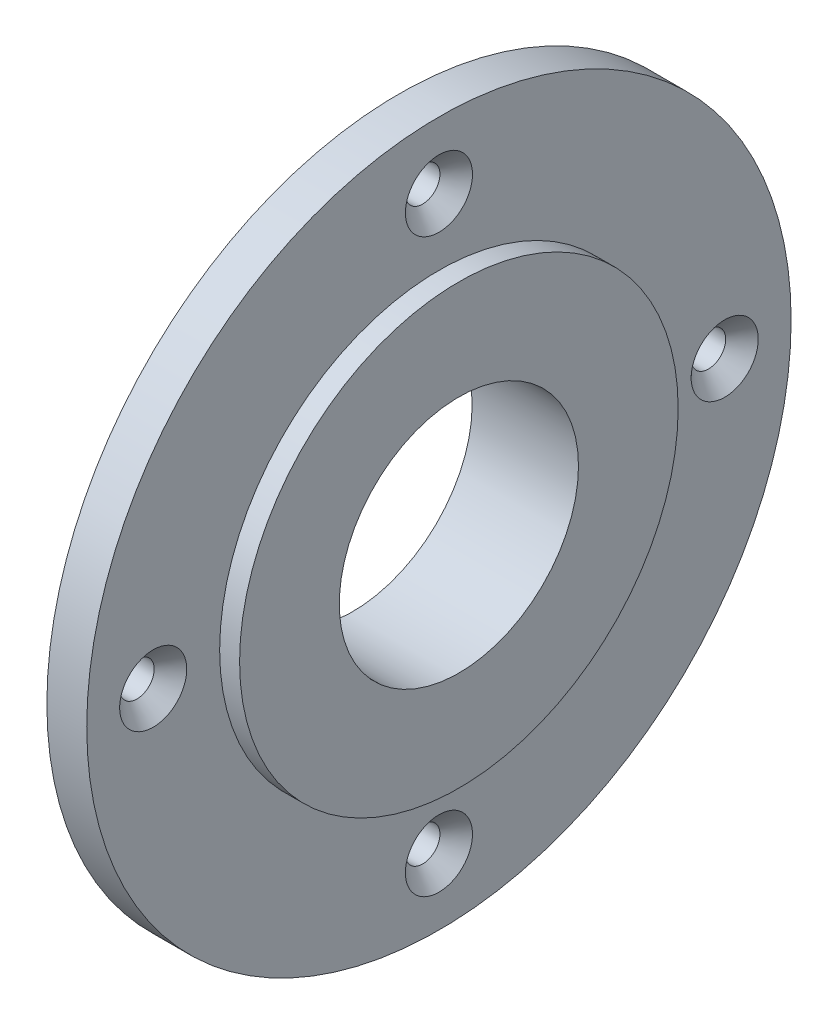
ISO-10303-21;
HEADER;
FILE_DESCRIPTION(('STEP AP214'),'2;1');
FILE_NAME('part.step','',(''),(''),'','','');
FILE_SCHEMA(('AUTOMOTIVE_DESIGN { 1 0 10303 214 1 1 1 1 }'));
ENDSEC;
DATA;
#1=APPLICATION_CONTEXT('core data for automotive mechanical design processes');
#2=APPLICATION_PROTOCOL_DEFINITION('international standard','automotive_design',2000,#1);
#3=PRODUCT_CONTEXT('',#1,'mechanical');
#4=PRODUCT('Part','Part','',(#3));
#5=PRODUCT_RELATED_PRODUCT_CATEGORY('part','',(#4));
#6=PRODUCT_DEFINITION_FORMATION('','',#4);
#7=PRODUCT_DEFINITION_CONTEXT('part definition',#1,'design');
#8=PRODUCT_DEFINITION('design','',#6,#7);
#9=PRODUCT_DEFINITION_SHAPE('','',#8);
#10=(LENGTH_UNIT() NAMED_UNIT(*) SI_UNIT(.MILLI.,.METRE.));
#11=(NAMED_UNIT(*) PLANE_ANGLE_UNIT() SI_UNIT($,.RADIAN.));
#12=(NAMED_UNIT(*) SI_UNIT($,.STERADIAN.) SOLID_ANGLE_UNIT());
#13=UNCERTAINTY_MEASURE_WITH_UNIT(LENGTH_MEASURE(1.E-05),#10,'distance_accuracy_value','');
#14=(GEOMETRIC_REPRESENTATION_CONTEXT(3) GLOBAL_UNCERTAINTY_ASSIGNED_CONTEXT((#13)) GLOBAL_UNIT_ASSIGNED_CONTEXT((#10,
#11,#12)) REPRESENTATION_CONTEXT('',''));
#15=CARTESIAN_POINT('',(0.,0.,0.));
#16=DIRECTION('',(0.,0.,1.));
#17=DIRECTION('',(1.,0.,0.));
#18=AXIS2_PLACEMENT_3D('',#15,#16,#17);
#19=CARTESIAN_POINT('',(-192.905599098805,18.,0.));
#20=DIRECTION('',(1.,0.,0.));
#21=DIRECTION('',(0.,0.,-1.));
#22=AXIS2_PLACEMENT_3D('',#19,#20,#21);
#23=PLANE('',#22);
#24=CARTESIAN_POINT('',(-192.905599098805,0.,0.));
#25=DIRECTION('',(1.,0.,0.));
#26=DIRECTION('',(0.,0.,-1.));
#27=AXIS2_PLACEMENT_3D('',#24,#25,#26);
#28=CIRCLE('',#27,33.);
#29=CARTESIAN_POINT('',(-192.905599098805,0.,-33.));
#30=VERTEX_POINT('',#29);
#31=EDGE_CURVE('E10',#30,#30,#28,.T.);
#32=ORIENTED_EDGE('',*,*,#31,.T.);
#33=EDGE_LOOP('',(#32));
#34=FACE_BOUND('',#33,.T.);
#35=CARTESIAN_POINT('',(-192.905599098805,0.,0.));
#36=DIRECTION('',(1.,0.,0.));
#37=DIRECTION('',(0.,0.,-1.));
#38=AXIS2_PLACEMENT_3D('',#35,#36,#37);
#39=CIRCLE('',#38,18.);
#40=CARTESIAN_POINT('',(-192.905599098805,0.,-18.));
#41=VERTEX_POINT('',#40);
#42=EDGE_CURVE('E60',#41,#41,#39,.T.);
#43=ORIENTED_EDGE('',*,*,#42,.F.);
#44=EDGE_LOOP('',(#43));
#45=FACE_BOUND('',#44,.T.);
#46=ADVANCED_FACE('F32',(#34,#45),#23,.T.);
#47=CARTESIAN_POINT('',(0.,0.,0.));
#48=DIRECTION('',(1.,0.,0.));
#49=DIRECTION('',(0.,0.,-1.));
#50=AXIS2_PLACEMENT_3D('',#47,#48,#49);
#51=CYLINDRICAL_SURFACE('',#50,33.);
#52=CARTESIAN_POINT('',(-195.905599098805,0.,0.));
#53=DIRECTION('',(1.,0.,0.));
#54=DIRECTION('',(0.,0.,-1.));
#55=AXIS2_PLACEMENT_3D('',#52,#53,#54);
#56=CIRCLE('',#55,33.);
#57=CARTESIAN_POINT('',(-195.905599098805,0.,-33.));
#58=VERTEX_POINT('',#57);
#59=EDGE_CURVE('E39',#58,#58,#56,.T.);
#60=ORIENTED_EDGE('',*,*,#59,.T.);
#61=EDGE_LOOP('',(#60));
#62=FACE_BOUND('',#61,.T.);
#63=ORIENTED_EDGE('',*,*,#31,.F.);
#64=EDGE_LOOP('',(#63));
#65=FACE_BOUND('',#64,.T.);
#66=ADVANCED_FACE('F103',(#62,#65),#51,.T.);
#67=CARTESIAN_POINT('',(-195.905599098805,33.,0.));
#68=DIRECTION('',(1.,0.,0.));
#69=DIRECTION('',(0.,0.,-1.));
#70=AXIS2_PLACEMENT_3D('',#67,#68,#69);
#71=PLANE('',#70);
#72=CARTESIAN_POINT('',(-195.905599098805,-1.50133697570255E-13,43.));
#73=DIRECTION('',(1.,0.,0.));
#74=DIRECTION('',(0.,1.,0.));
#75=AXIS2_PLACEMENT_3D('',#72,#73,#74);
#76=CIRCLE('',#75,5.05);
#77=CARTESIAN_POINT('',(-195.905599098805,5.04999999999985,43.));
#78=VERTEX_POINT('',#77);
#79=EDGE_CURVE('E83',#78,#78,#76,.T.);
#80=ORIENTED_EDGE('',*,*,#79,.F.);
#81=EDGE_LOOP('',(#80));
#82=FACE_BOUND('',#81,.T.);
#83=CARTESIAN_POINT('',(-195.905599098805,-43.,0.));
#84=DIRECTION('',(1.,0.,0.));
#85=DIRECTION('',(0.,0.,1.));
#86=AXIS2_PLACEMENT_3D('',#83,#84,#85);
#87=CIRCLE('',#86,5.05);
#88=CARTESIAN_POINT('',(-195.905599098805,-43.,5.05));
#89=VERTEX_POINT('',#88);
#90=EDGE_CURVE('E73',#89,#89,#87,.T.);
#91=ORIENTED_EDGE('',*,*,#90,.F.);
#92=EDGE_LOOP('',(#91));
#93=FACE_BOUND('',#92,.T.);
#94=CARTESIAN_POINT('',(-195.905599098805,4.50401092710764E-13,-43.));
#95=DIRECTION('',(1.,0.,0.));
#96=DIRECTION('',(0.,-1.,0.));
#97=AXIS2_PLACEMENT_3D('',#94,#95,#96);
#98=CIRCLE('',#97,5.05);
#99=CARTESIAN_POINT('',(-195.905599098805,-5.04999999999955,-43.));
#100=VERTEX_POINT('',#99);
#101=EDGE_CURVE('E77',#100,#100,#98,.T.);
#102=ORIENTED_EDGE('',*,*,#101,.F.);
#103=EDGE_LOOP('',(#102));
#104=FACE_BOUND('',#103,.T.);
#105=CARTESIAN_POINT('',(-195.905599098805,43.,0.));
#106=DIRECTION('',(1.,0.,0.));
#107=DIRECTION('',(0.,0.,-1.));
#108=AXIS2_PLACEMENT_3D('',#105,#106,#107);
#109=CIRCLE('',#108,5.05);
#110=CARTESIAN_POINT('',(-195.905599098805,43.,-5.05));
#111=VERTEX_POINT('',#110);
#112=EDGE_CURVE('E66',#111,#111,#109,.T.);
#113=ORIENTED_EDGE('',*,*,#112,.F.);
#114=EDGE_LOOP('',(#113));
#115=FACE_BOUND('',#114,.T.);
#116=CARTESIAN_POINT('',(-195.905599098805,0.,0.));
#117=DIRECTION('',(1.,0.,0.));
#118=DIRECTION('',(0.,0.,-1.));
#119=AXIS2_PLACEMENT_3D('',#116,#117,#118);
#120=CIRCLE('',#119,53.);
#121=CARTESIAN_POINT('',(-195.905599098805,0.,-53.));
#122=VERTEX_POINT('',#121);
#123=EDGE_CURVE('E43',#122,#122,#120,.T.);
#124=ORIENTED_EDGE('',*,*,#123,.T.);
#125=EDGE_LOOP('',(#124));
#126=FACE_BOUND('',#125,.T.);
#127=ORIENTED_EDGE('',*,*,#59,.F.);
#128=EDGE_LOOP('',(#127));
#129=FACE_BOUND('',#128,.T.);
#130=ADVANCED_FACE('F99',(#82,#93,#104,#115,#126,#129),#71,.T.);
#131=CARTESIAN_POINT('',(0.,0.,0.));
#132=DIRECTION('',(1.,0.,0.));
#133=DIRECTION('',(0.,0.,-1.));
#134=AXIS2_PLACEMENT_3D('',#131,#132,#133);
#135=CYLINDRICAL_SURFACE('',#134,53.);
#136=CARTESIAN_POINT('',(-201.905599098805,0.,0.));
#137=DIRECTION('',(1.,0.,0.));
#138=DIRECTION('',(0.,0.,-1.));
#139=AXIS2_PLACEMENT_3D('',#136,#137,#138);
#140=CIRCLE('',#139,53.);
#141=CARTESIAN_POINT('',(-201.905599098805,0.,-53.));
#142=VERTEX_POINT('',#141);
#143=EDGE_CURVE('E48',#142,#142,#140,.T.);
#144=ORIENTED_EDGE('',*,*,#143,.T.);
#145=EDGE_LOOP('',(#144));
#146=FACE_BOUND('',#145,.T.);
#147=ORIENTED_EDGE('',*,*,#123,.F.);
#148=EDGE_LOOP('',(#147));
#149=FACE_BOUND('',#148,.T.);
#150=ADVANCED_FACE('F102',(#146,#149),#135,.T.);
#151=CARTESIAN_POINT('',(-201.905599098805,53.,0.));
#152=DIRECTION('',(-1.,0.,0.));
#153=DIRECTION('',(0.,0.,1.));
#154=AXIS2_PLACEMENT_3D('',#151,#152,#153);
#155=PLANE('',#154);
#156=CARTESIAN_POINT('',(-201.905599098805,-1.50133697570255E-13,43.));
#157=DIRECTION('',(-1.,0.,0.));
#158=DIRECTION('',(0.,-1.,0.));
#159=AXIS2_PLACEMENT_3D('',#156,#157,#158);
#160=CIRCLE('',#159,2.6);
#161=CARTESIAN_POINT('',(-201.905599098805,-2.60000000000015,43.));
#162=VERTEX_POINT('',#161);
#163=EDGE_CURVE('E91',#162,#162,#160,.T.);
#164=ORIENTED_EDGE('',*,*,#163,.F.);
#165=EDGE_LOOP('',(#164));
#166=FACE_BOUND('',#165,.T.);
#167=CARTESIAN_POINT('',(-201.905599098805,-43.,0.));
#168=DIRECTION('',(-1.,0.,0.));
#169=DIRECTION('',(0.,0.,-1.));
#170=AXIS2_PLACEMENT_3D('',#167,#168,#169);
#171=CIRCLE('',#170,2.6);
#172=CARTESIAN_POINT('',(-201.905599098805,-43.,-2.6));
#173=VERTEX_POINT('',#172);
#174=EDGE_CURVE('E84',#173,#173,#171,.T.);
#175=ORIENTED_EDGE('',*,*,#174,.F.);
#176=EDGE_LOOP('',(#175));
#177=FACE_BOUND('',#176,.T.);
#178=CARTESIAN_POINT('',(-201.905599098805,4.50401092710764E-13,-43.));
#179=DIRECTION('',(-1.,0.,0.));
#180=DIRECTION('',(0.,1.,0.));
#181=AXIS2_PLACEMENT_3D('',#178,#179,#180);
#182=CIRCLE('',#181,2.6);
#183=CARTESIAN_POINT('',(-201.905599098805,2.60000000000045,-43.));
#184=VERTEX_POINT('',#183);
#185=EDGE_CURVE('E74',#184,#184,#182,.T.);
#186=ORIENTED_EDGE('',*,*,#185,.F.);
#187=EDGE_LOOP('',(#186));
#188=FACE_BOUND('',#187,.T.);
#189=CARTESIAN_POINT('',(-201.905599098805,43.,0.));
#190=DIRECTION('',(-1.,0.,0.));
#191=DIRECTION('',(0.,0.,1.));
#192=AXIS2_PLACEMENT_3D('',#189,#190,#191);
#193=CIRCLE('',#192,2.6);
#194=CARTESIAN_POINT('',(-201.905599098805,43.,2.6));
#195=VERTEX_POINT('',#194);
#196=EDGE_CURVE('E35',#195,#195,#193,.T.);
#197=ORIENTED_EDGE('',*,*,#196,.F.);
#198=EDGE_LOOP('',(#197));
#199=FACE_BOUND('',#198,.T.);
#200=CARTESIAN_POINT('',(-201.905599098805,0.,0.));
#201=DIRECTION('',(1.,0.,0.));
#202=DIRECTION('',(0.,0.,-1.));
#203=AXIS2_PLACEMENT_3D('',#200,#201,#202);
#204=CIRCLE('',#203,21.);
#205=CARTESIAN_POINT('',(-201.905599098805,0.,-21.));
#206=VERTEX_POINT('',#205);
#207=EDGE_CURVE('E51',#206,#206,#204,.T.);
#208=ORIENTED_EDGE('',*,*,#207,.T.);
#209=EDGE_LOOP('',(#208));
#210=FACE_BOUND('',#209,.T.);
#211=ORIENTED_EDGE('',*,*,#143,.F.);
#212=EDGE_LOOP('',(#211));
#213=FACE_BOUND('',#212,.T.);
#214=ADVANCED_FACE('F123',(#166,#177,#188,#199,#210,#213),#155,.T.);
#215=CARTESIAN_POINT('',(0.,0.,0.));
#216=DIRECTION('',(1.,0.,0.));
#217=DIRECTION('',(0.,0.,-1.));
#218=AXIS2_PLACEMENT_3D('',#215,#216,#217);
#219=CYLINDRICAL_SURFACE('',#218,21.);
#220=CARTESIAN_POINT('',(-208.905599098805,0.,0.));
#221=DIRECTION('',(1.,0.,0.));
#222=DIRECTION('',(0.,0.,-1.));
#223=AXIS2_PLACEMENT_3D('',#220,#221,#222);
#224=CIRCLE('',#223,21.);
#225=CARTESIAN_POINT('',(-208.905599098805,0.,-21.));
#226=VERTEX_POINT('',#225);
#227=EDGE_CURVE('E54',#226,#226,#224,.T.);
#228=ORIENTED_EDGE('',*,*,#227,.T.);
#229=EDGE_LOOP('',(#228));
#230=FACE_BOUND('',#229,.T.);
#231=ORIENTED_EDGE('',*,*,#207,.F.);
#232=EDGE_LOOP('',(#231));
#233=FACE_BOUND('',#232,.T.);
#234=ADVANCED_FACE('F127',(#230,#233),#219,.T.);
#235=CARTESIAN_POINT('',(-208.905599098805,21.,0.));
#236=DIRECTION('',(-1.,0.,0.));
#237=DIRECTION('',(0.,0.,1.));
#238=AXIS2_PLACEMENT_3D('',#235,#236,#237);
#239=PLANE('',#238);
#240=CARTESIAN_POINT('',(-208.905599098805,0.,0.));
#241=DIRECTION('',(1.,0.,0.));
#242=DIRECTION('',(0.,0.,-1.));
#243=AXIS2_PLACEMENT_3D('',#240,#241,#242);
#244=CIRCLE('',#243,18.);
#245=CARTESIAN_POINT('',(-208.905599098805,0.,-18.));
#246=VERTEX_POINT('',#245);
#247=EDGE_CURVE('E57',#246,#246,#244,.T.);
#248=ORIENTED_EDGE('',*,*,#247,.T.);
#249=EDGE_LOOP('',(#248));
#250=FACE_BOUND('',#249,.T.);
#251=ORIENTED_EDGE('',*,*,#227,.F.);
#252=EDGE_LOOP('',(#251));
#253=FACE_BOUND('',#252,.T.);
#254=ADVANCED_FACE('F131',(#250,#253),#239,.T.);
#255=CARTESIAN_POINT('',(0.,0.,0.));
#256=DIRECTION('',(1.,0.,0.));
#257=DIRECTION('',(0.,0.,-1.));
#258=AXIS2_PLACEMENT_3D('',#255,#256,#257);
#259=CYLINDRICAL_SURFACE('',#258,18.);
#260=ORIENTED_EDGE('',*,*,#42,.T.);
#261=EDGE_LOOP('',(#260));
#262=FACE_BOUND('',#261,.T.);
#263=ORIENTED_EDGE('',*,*,#247,.F.);
#264=EDGE_LOOP('',(#263));
#265=FACE_BOUND('',#264,.T.);
#266=ADVANCED_FACE('F135',(#262,#265),#259,.F.);
#267=CARTESIAN_POINT('',(-195.905599098805,43.,0.));
#268=DIRECTION('',(1.,0.,0.));
#269=DIRECTION('',(0.,0.,-1.));
#270=AXIS2_PLACEMENT_3D('',#267,#268,#269);
#271=CYLINDRICAL_SURFACE('',#270,2.6);
#272=ORIENTED_EDGE('',*,*,#196,.T.);
#273=EDGE_LOOP('',(#272));
#274=FACE_BOUND('',#273,.T.);
#275=CARTESIAN_POINT('',(-198.355599098805,43.,0.));
#276=DIRECTION('',(1.,0.,0.));
#277=DIRECTION('',(0.,0.,-1.));
#278=AXIS2_PLACEMENT_3D('',#275,#276,#277);
#279=CIRCLE('',#278,2.6);
#280=CARTESIAN_POINT('',(-198.355599098805,43.,-2.6));
#281=VERTEX_POINT('',#280);
#282=EDGE_CURVE('E63',#281,#281,#279,.T.);
#283=ORIENTED_EDGE('',*,*,#282,.T.);
#284=EDGE_LOOP('',(#283));
#285=FACE_BOUND('',#284,.T.);
#286=ADVANCED_FACE('F139',(#274,#285),#271,.F.);
#287=CARTESIAN_POINT('',(-195.905599098805,43.,0.));
#288=DIRECTION('',(1.,0.,0.));
#289=DIRECTION('',(0.,0.,-1.));
#290=AXIS2_PLACEMENT_3D('',#287,#288,#289);
#291=CONICAL_SURFACE('',#290,5.05,0.785398163397447);
#292=ORIENTED_EDGE('',*,*,#282,.F.);
#293=EDGE_LOOP('',(#292));
#294=FACE_BOUND('',#293,.T.);
#295=ORIENTED_EDGE('',*,*,#112,.T.);
#296=EDGE_LOOP('',(#295));
#297=FACE_BOUND('',#296,.T.);
#298=ADVANCED_FACE('F143',(#294,#297),#291,.F.);
#299=CARTESIAN_POINT('',(-195.905599098805,4.50401092710764E-13,-43.));
#300=DIRECTION('',(1.,0.,0.));
#301=DIRECTION('',(0.,-1.,0.));
#302=AXIS2_PLACEMENT_3D('',#299,#300,#301);
#303=CYLINDRICAL_SURFACE('',#302,2.6);
#304=ORIENTED_EDGE('',*,*,#185,.T.);
#305=EDGE_LOOP('',(#304));
#306=FACE_BOUND('',#305,.T.);
#307=CARTESIAN_POINT('',(-198.355599098805,4.50401092710764E-13,-43.));
#308=DIRECTION('',(1.,0.,0.));
#309=DIRECTION('',(0.,-1.,0.));
#310=AXIS2_PLACEMENT_3D('',#307,#308,#309);
#311=CIRCLE('',#310,2.6);
#312=CARTESIAN_POINT('',(-198.355599098805,-2.59999999999955,-43.));
#313=VERTEX_POINT('',#312);
#314=EDGE_CURVE('E70',#313,#313,#311,.T.);
#315=ORIENTED_EDGE('',*,*,#314,.T.);
#316=EDGE_LOOP('',(#315));
#317=FACE_BOUND('',#316,.T.);
#318=ADVANCED_FACE('F147',(#306,#317),#303,.F.);
#319=CARTESIAN_POINT('',(-195.905599098805,4.50401092710764E-13,-43.));
#320=DIRECTION('',(1.,0.,0.));
#321=DIRECTION('',(0.,-1.,0.));
#322=AXIS2_PLACEMENT_3D('',#319,#320,#321);
#323=CONICAL_SURFACE('',#322,5.05,0.785398163397447);
#324=ORIENTED_EDGE('',*,*,#314,.F.);
#325=EDGE_LOOP('',(#324));
#326=FACE_BOUND('',#325,.T.);
#327=ORIENTED_EDGE('',*,*,#101,.T.);
#328=EDGE_LOOP('',(#327));
#329=FACE_BOUND('',#328,.T.);
#330=ADVANCED_FACE('F151',(#326,#329),#323,.F.);
#331=CARTESIAN_POINT('',(-195.905599098805,-43.,0.));
#332=DIRECTION('',(1.,0.,0.));
#333=DIRECTION('',(0.,0.,1.));
#334=AXIS2_PLACEMENT_3D('',#331,#332,#333);
#335=CYLINDRICAL_SURFACE('',#334,2.6);
#336=ORIENTED_EDGE('',*,*,#174,.T.);
#337=EDGE_LOOP('',(#336));
#338=FACE_BOUND('',#337,.T.);
#339=CARTESIAN_POINT('',(-198.355599098805,-43.,0.));
#340=DIRECTION('',(1.,0.,0.));
#341=DIRECTION('',(0.,0.,1.));
#342=AXIS2_PLACEMENT_3D('',#339,#340,#341);
#343=CIRCLE('',#342,2.6);
#344=CARTESIAN_POINT('',(-198.355599098805,-43.,2.6));
#345=VERTEX_POINT('',#344);
#346=EDGE_CURVE('E80',#345,#345,#343,.T.);
#347=ORIENTED_EDGE('',*,*,#346,.T.);
#348=EDGE_LOOP('',(#347));
#349=FACE_BOUND('',#348,.T.);
#350=ADVANCED_FACE('F155',(#338,#349),#335,.F.);
#351=CARTESIAN_POINT('',(-195.905599098805,-43.,0.));
#352=DIRECTION('',(1.,0.,0.));
#353=DIRECTION('',(0.,0.,1.));
#354=AXIS2_PLACEMENT_3D('',#351,#352,#353);
#355=CONICAL_SURFACE('',#354,5.05,0.785398163397447);
#356=ORIENTED_EDGE('',*,*,#346,.F.);
#357=EDGE_LOOP('',(#356));
#358=FACE_BOUND('',#357,.T.);
#359=ORIENTED_EDGE('',*,*,#90,.T.);
#360=EDGE_LOOP('',(#359));
#361=FACE_BOUND('',#360,.T.);
#362=ADVANCED_FACE('F159',(#358,#361),#355,.F.);
#363=CARTESIAN_POINT('',(-195.905599098805,-1.50133697570255E-13,43.));
#364=DIRECTION('',(1.,0.,0.));
#365=DIRECTION('',(0.,1.,0.));
#366=AXIS2_PLACEMENT_3D('',#363,#364,#365);
#367=CYLINDRICAL_SURFACE('',#366,2.6);
#368=ORIENTED_EDGE('',*,*,#163,.T.);
#369=EDGE_LOOP('',(#368));
#370=FACE_BOUND('',#369,.T.);
#371=CARTESIAN_POINT('',(-198.355599098805,-1.50133697570255E-13,43.));
#372=DIRECTION('',(1.,0.,0.));
#373=DIRECTION('',(0.,1.,0.));
#374=AXIS2_PLACEMENT_3D('',#371,#372,#373);
#375=CIRCLE('',#374,2.6);
#376=CARTESIAN_POINT('',(-198.355599098805,2.59999999999985,43.));
#377=VERTEX_POINT('',#376);
#378=EDGE_CURVE('E69',#377,#377,#375,.T.);
#379=ORIENTED_EDGE('',*,*,#378,.T.);
#380=EDGE_LOOP('',(#379));
#381=FACE_BOUND('',#380,.T.);
#382=ADVANCED_FACE('F163',(#370,#381),#367,.F.);
#383=CARTESIAN_POINT('',(-195.905599098805,-1.50133697570255E-13,43.));
#384=DIRECTION('',(1.,0.,0.));
#385=DIRECTION('',(0.,1.,0.));
#386=AXIS2_PLACEMENT_3D('',#383,#384,#385);
#387=CONICAL_SURFACE('',#386,5.05,0.785398163397447);
#388=ORIENTED_EDGE('',*,*,#378,.F.);
#389=EDGE_LOOP('',(#388));
#390=FACE_BOUND('',#389,.T.);
#391=ORIENTED_EDGE('',*,*,#79,.T.);
#392=EDGE_LOOP('',(#391));
#393=FACE_BOUND('',#392,.T.);
#394=ADVANCED_FACE('F97',(#390,#393),#387,.F.);
#395=CLOSED_SHELL('',(#46,#66,#130,#150,#214,#234,#254,#266,#286,#298,#318,#330,#350,#362,#382,#394));
#396=MANIFOLD_SOLID_BREP('B2',#395);
#397=ADVANCED_BREP_SHAPE_REPRESENTATION('',(#18,#396),#14);
#398=SHAPE_DEFINITION_REPRESENTATION(#9,#397);
ENDSEC;
END-ISO-10303-21;
